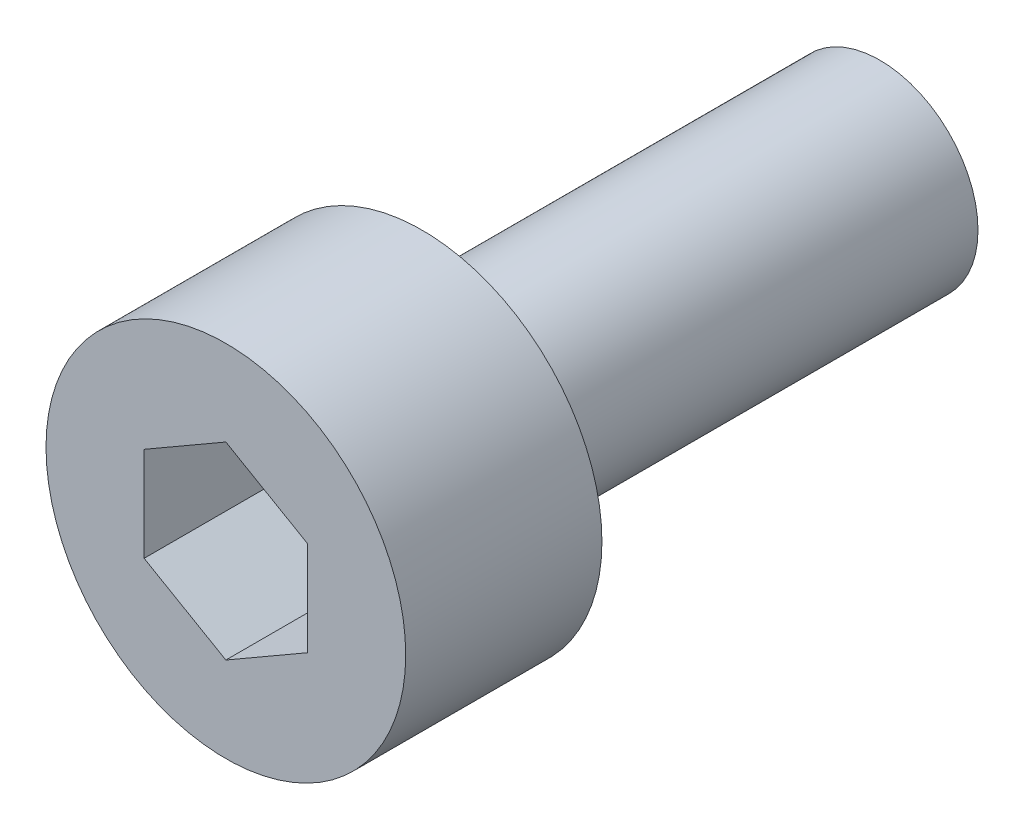
ISO-10303-21;
HEADER;
FILE_DESCRIPTION(('STEP AP214'),'2;1');
FILE_NAME('part.step','',(''),(''),'','','');
FILE_SCHEMA(('AUTOMOTIVE_DESIGN { 1 0 10303 214 1 1 1 1 }'));
ENDSEC;
DATA;
#1=APPLICATION_CONTEXT('core data for automotive mechanical design processes');
#2=APPLICATION_PROTOCOL_DEFINITION('international standard','automotive_design',2000,#1);
#3=PRODUCT_CONTEXT('',#1,'mechanical');
#4=PRODUCT('Part','Part','',(#3));
#5=PRODUCT_RELATED_PRODUCT_CATEGORY('part','',(#4));
#6=PRODUCT_DEFINITION_FORMATION('','',#4);
#7=PRODUCT_DEFINITION_CONTEXT('part definition',#1,'design');
#8=PRODUCT_DEFINITION('design','',#6,#7);
#9=PRODUCT_DEFINITION_SHAPE('','',#8);
#10=(LENGTH_UNIT() NAMED_UNIT(*) SI_UNIT(.MILLI.,.METRE.));
#11=(NAMED_UNIT(*) PLANE_ANGLE_UNIT() SI_UNIT($,.RADIAN.));
#12=(NAMED_UNIT(*) SI_UNIT($,.STERADIAN.) SOLID_ANGLE_UNIT());
#13=UNCERTAINTY_MEASURE_WITH_UNIT(LENGTH_MEASURE(1.E-05),#10,'distance_accuracy_value','');
#14=(GEOMETRIC_REPRESENTATION_CONTEXT(3) GLOBAL_UNCERTAINTY_ASSIGNED_CONTEXT((#13)) GLOBAL_UNIT_ASSIGNED_CONTEXT((#10,
#11,#12)) REPRESENTATION_CONTEXT('',''));
#15=CARTESIAN_POINT('',(0.,0.,0.));
#16=DIRECTION('',(0.,0.,1.));
#17=DIRECTION('',(1.,0.,0.));
#18=AXIS2_PLACEMENT_3D('',#15,#16,#17);
#19=CARTESIAN_POINT('',(0.,0.,0.));
#20=DIRECTION('',(0.,0.,-1.));
#21=DIRECTION('',(-1.,0.,0.));
#22=AXIS2_PLACEMENT_3D('',#19,#20,#21);
#23=CYLINDRICAL_SURFACE('',#22,1.5);
#24=CARTESIAN_POINT('',(0.,0.,0.));
#25=DIRECTION('',(0.,0.,1.));
#26=DIRECTION('',(1.,0.,0.));
#27=AXIS2_PLACEMENT_3D('',#24,#25,#26);
#28=CIRCLE('',#27,1.5);
#29=CARTESIAN_POINT('',(1.5,0.,0.));
#30=VERTEX_POINT('',#29);
#31=EDGE_CURVE('E11',#30,#30,#28,.T.);
#32=ORIENTED_EDGE('',*,*,#31,.F.);
#33=EDGE_LOOP('',(#32));
#34=FACE_BOUND('',#33,.T.);
#35=CARTESIAN_POINT('',(0.,0.,-7.));
#36=DIRECTION('',(0.,0.,1.));
#37=DIRECTION('',(1.,0.,0.));
#38=AXIS2_PLACEMENT_3D('',#35,#36,#37);
#39=CIRCLE('',#38,1.5);
#40=CARTESIAN_POINT('',(1.5,0.,-7.));
#41=VERTEX_POINT('',#40);
#42=EDGE_CURVE('E46',#41,#41,#39,.T.);
#43=ORIENTED_EDGE('',*,*,#42,.T.);
#44=EDGE_LOOP('',(#43));
#45=FACE_BOUND('',#44,.T.);
#46=ADVANCED_FACE('F43',(#34,#45),#23,.T.);
#47=CARTESIAN_POINT('',(0.,0.,-7.));
#48=DIRECTION('',(0.,0.,1.));
#49=DIRECTION('',(1.,0.,0.));
#50=AXIS2_PLACEMENT_3D('',#47,#48,#49);
#51=PLANE('',#50);
#52=ORIENTED_EDGE('',*,*,#42,.F.);
#53=EDGE_LOOP('',(#52));
#54=FACE_BOUND('',#53,.T.);
#55=ADVANCED_FACE('F164',(#54),#51,.F.);
#56=CARTESIAN_POINT('',(0.,0.,3.));
#57=DIRECTION('',(0.,0.,1.));
#58=DIRECTION('',(1.,0.,0.));
#59=AXIS2_PLACEMENT_3D('',#56,#57,#58);
#60=PLANE('',#59);
#61=CARTESIAN_POINT('',(0.,0.,3.));
#62=DIRECTION('',(0.,0.,1.));
#63=DIRECTION('',(1.,0.,0.));
#64=AXIS2_PLACEMENT_3D('',#61,#62,#63);
#65=CIRCLE('',#64,2.75);
#66=CARTESIAN_POINT('',(2.75,0.,3.));
#67=VERTEX_POINT('',#66);
#68=EDGE_CURVE('E146',#67,#67,#65,.T.);
#69=ORIENTED_EDGE('',*,*,#68,.T.);
#70=EDGE_LOOP('',(#69));
#71=FACE_BOUND('',#70,.T.);
#72=DIRECTION('',(-0.866025403784439,0.5,0.));
#73=VECTOR('',#72,1.);
#74=CARTESIAN_POINT('',(1.25,0.721687836487032,3.));
#75=LINE('',#74,#73);
#76=CARTESIAN_POINT('',(1.25,0.721687836487032,3.));
#77=VERTEX_POINT('',#76);
#78=CARTESIAN_POINT('',(0.,1.44337567297406,3.));
#79=VERTEX_POINT('',#78);
#80=EDGE_CURVE('E103',#77,#79,#75,.T.);
#81=ORIENTED_EDGE('',*,*,#80,.F.);
#82=DIRECTION('',(0.,1.,0.));
#83=VECTOR('',#82,1.);
#84=CARTESIAN_POINT('',(1.25,-0.721687836487033,3.));
#85=LINE('',#84,#83);
#86=CARTESIAN_POINT('',(1.25,-0.721687836487033,3.));
#87=VERTEX_POINT('',#86);
#88=EDGE_CURVE('E94',#87,#77,#85,.T.);
#89=ORIENTED_EDGE('',*,*,#88,.F.);
#90=DIRECTION('',(0.866025403784439,0.5,0.));
#91=VECTOR('',#90,1.);
#92=CARTESIAN_POINT('',(0.,-1.44337567297406,3.));
#93=LINE('',#92,#91);
#94=CARTESIAN_POINT('',(0.,-1.44337567297406,3.));
#95=VERTEX_POINT('',#94);
#96=EDGE_CURVE('E124',#95,#87,#93,.T.);
#97=ORIENTED_EDGE('',*,*,#96,.F.);
#98=DIRECTION('',(0.866025403784439,-0.5,0.));
#99=VECTOR('',#98,1.);
#100=CARTESIAN_POINT('',(-1.25,-0.721687836487032,3.));
#101=LINE('',#100,#99);
#102=CARTESIAN_POINT('',(-1.25,-0.721687836487032,3.));
#103=VERTEX_POINT('',#102);
#104=EDGE_CURVE('E121',#103,#95,#101,.T.);
#105=ORIENTED_EDGE('',*,*,#104,.F.);
#106=DIRECTION('',(0.,-1.,0.));
#107=VECTOR('',#106,1.);
#108=CARTESIAN_POINT('',(-1.25,0.721687836487032,3.));
#109=LINE('',#108,#107);
#110=CARTESIAN_POINT('',(-1.25,0.721687836487032,3.));
#111=VERTEX_POINT('',#110);
#112=EDGE_CURVE('E117',#111,#103,#109,.T.);
#113=ORIENTED_EDGE('',*,*,#112,.F.);
#114=DIRECTION('',(-0.866025403784439,-0.5,0.));
#115=VECTOR('',#114,1.);
#116=CARTESIAN_POINT('',(0.,1.44337567297406,3.));
#117=LINE('',#116,#115);
#118=EDGE_CURVE('E115',#79,#111,#117,.T.);
#119=ORIENTED_EDGE('',*,*,#118,.F.);
#120=EDGE_LOOP('',(#81,#89,#97,#105,#113,#119));
#121=FACE_BOUND('',#120,.T.);
#122=ADVANCED_FACE('F113',(#71,#121),#60,.T.);
#123=CARTESIAN_POINT('',(0.,0.,0.));
#124=DIRECTION('',(0.,0.,1.));
#125=DIRECTION('',(1.,0.,0.));
#126=AXIS2_PLACEMENT_3D('',#123,#124,#125);
#127=PLANE('',#126);
#128=ORIENTED_EDGE('',*,*,#31,.T.);
#129=EDGE_LOOP('',(#128));
#130=FACE_BOUND('',#129,.T.);
#131=CARTESIAN_POINT('',(0.,0.,0.));
#132=DIRECTION('',(0.,0.,1.));
#133=DIRECTION('',(1.,0.,0.));
#134=AXIS2_PLACEMENT_3D('',#131,#132,#133);
#135=CIRCLE('',#134,2.75);
#136=CARTESIAN_POINT('',(2.75,0.,0.));
#137=VERTEX_POINT('',#136);
#138=EDGE_CURVE('E109',#137,#137,#135,.T.);
#139=ORIENTED_EDGE('',*,*,#138,.F.);
#140=EDGE_LOOP('',(#139));
#141=FACE_BOUND('',#140,.T.);
#142=ADVANCED_FACE('F154',(#130,#141),#127,.F.);
#143=CARTESIAN_POINT('',(0.,0.,3.));
#144=DIRECTION('',(0.,0.,-1.));
#145=DIRECTION('',(-1.,0.,0.));
#146=AXIS2_PLACEMENT_3D('',#143,#144,#145);
#147=CYLINDRICAL_SURFACE('',#146,2.75);
#148=ORIENTED_EDGE('',*,*,#68,.F.);
#149=EDGE_LOOP('',(#148));
#150=FACE_BOUND('',#149,.T.);
#151=ORIENTED_EDGE('',*,*,#138,.T.);
#152=EDGE_LOOP('',(#151));
#153=FACE_BOUND('',#152,.T.);
#154=ADVANCED_FACE('F152',(#150,#153),#147,.T.);
#155=CARTESIAN_POINT('',(1.25,-0.721687836487033,3.));
#156=DIRECTION('',(-1.,0.,0.));
#157=DIRECTION('',(0.,-1.,0.));
#158=AXIS2_PLACEMENT_3D('',#155,#156,#157);
#159=PLANE('',#158);
#160=DIRECTION('',(0.,1.,0.));
#161=VECTOR('',#160,1.);
#162=CARTESIAN_POINT('',(1.25,-0.721687836487033,0.));
#163=LINE('',#162,#161);
#164=CARTESIAN_POINT('',(1.25,-0.721687836487033,0.));
#165=VERTEX_POINT('',#164);
#166=CARTESIAN_POINT('',(1.25,0.721687836487032,0.));
#167=VERTEX_POINT('',#166);
#168=EDGE_CURVE('E57',#165,#167,#163,.T.);
#169=ORIENTED_EDGE('',*,*,#168,.F.);
#170=DIRECTION('',(0.,0.,-1.));
#171=VECTOR('',#170,1.);
#172=CARTESIAN_POINT('',(1.25,-0.721687836487033,3.));
#173=LINE('',#172,#171);
#174=EDGE_CURVE('E99',#87,#165,#173,.T.);
#175=ORIENTED_EDGE('',*,*,#174,.F.);
#176=ORIENTED_EDGE('',*,*,#88,.T.);
#177=DIRECTION('',(0.,0.,-1.));
#178=VECTOR('',#177,1.);
#179=CARTESIAN_POINT('',(1.25,0.721687836487032,3.));
#180=LINE('',#179,#178);
#181=EDGE_CURVE('E97',#77,#167,#180,.T.);
#182=ORIENTED_EDGE('',*,*,#181,.T.);
#183=EDGE_LOOP('',(#169,#175,#176,#182));
#184=FACE_BOUND('',#183,.T.);
#185=ADVANCED_FACE('F96',(#184),#159,.T.);
#186=CARTESIAN_POINT('',(1.25,0.721687836487032,3.));
#187=DIRECTION('',(-0.5,-0.866025403784439,0.));
#188=DIRECTION('',(0.866025403784439,-0.5,0.));
#189=AXIS2_PLACEMENT_3D('',#186,#187,#188);
#190=PLANE('',#189);
#191=DIRECTION('',(-0.866025403784439,0.5,0.));
#192=VECTOR('',#191,1.);
#193=CARTESIAN_POINT('',(1.25,0.721687836487032,0.));
#194=LINE('',#193,#192);
#195=CARTESIAN_POINT('',(0.,1.44337567297406,0.));
#196=VERTEX_POINT('',#195);
#197=EDGE_CURVE('E61',#167,#196,#194,.T.);
#198=ORIENTED_EDGE('',*,*,#197,.F.);
#199=ORIENTED_EDGE('',*,*,#181,.F.);
#200=ORIENTED_EDGE('',*,*,#80,.T.);
#201=DIRECTION('',(0.,0.,-1.));
#202=VECTOR('',#201,1.);
#203=CARTESIAN_POINT('',(0.,1.44337567297406,3.));
#204=LINE('',#203,#202);
#205=EDGE_CURVE('E110',#79,#196,#204,.T.);
#206=ORIENTED_EDGE('',*,*,#205,.T.);
#207=EDGE_LOOP('',(#198,#199,#200,#206));
#208=FACE_BOUND('',#207,.T.);
#209=ADVANCED_FACE('F107',(#208),#190,.T.);
#210=CARTESIAN_POINT('',(0.,1.44337567297406,3.));
#211=DIRECTION('',(0.5,-0.866025403784439,0.));
#212=DIRECTION('',(0.866025403784439,0.5,0.));
#213=AXIS2_PLACEMENT_3D('',#210,#211,#212);
#214=PLANE('',#213);
#215=DIRECTION('',(-0.866025403784439,-0.5,0.));
#216=VECTOR('',#215,1.);
#217=CARTESIAN_POINT('',(0.,1.44337567297406,0.));
#218=LINE('',#217,#216);
#219=CARTESIAN_POINT('',(-1.25,0.721687836487032,0.));
#220=VERTEX_POINT('',#219);
#221=EDGE_CURVE('E128',#196,#220,#218,.T.);
#222=ORIENTED_EDGE('',*,*,#221,.F.);
#223=ORIENTED_EDGE('',*,*,#205,.F.);
#224=ORIENTED_EDGE('',*,*,#118,.T.);
#225=DIRECTION('',(0.,0.,-1.));
#226=VECTOR('',#225,1.);
#227=CARTESIAN_POINT('',(-1.25,0.721687836487032,3.));
#228=LINE('',#227,#226);
#229=EDGE_CURVE('E142',#111,#220,#228,.T.);
#230=ORIENTED_EDGE('',*,*,#229,.T.);
#231=EDGE_LOOP('',(#222,#223,#224,#230));
#232=FACE_BOUND('',#231,.T.);
#233=ADVANCED_FACE('F199',(#232),#214,.T.);
#234=CARTESIAN_POINT('',(-1.25,0.721687836487032,3.));
#235=DIRECTION('',(1.,0.,0.));
#236=DIRECTION('',(0.,1.,0.));
#237=AXIS2_PLACEMENT_3D('',#234,#235,#236);
#238=PLANE('',#237);
#239=DIRECTION('',(0.,-1.,0.));
#240=VECTOR('',#239,1.);
#241=CARTESIAN_POINT('',(-1.25,0.721687836487032,0.));
#242=LINE('',#241,#240);
#243=CARTESIAN_POINT('',(-1.25,-0.721687836487033,0.));
#244=VERTEX_POINT('',#243);
#245=EDGE_CURVE('E130',#220,#244,#242,.T.);
#246=ORIENTED_EDGE('',*,*,#245,.F.);
#247=ORIENTED_EDGE('',*,*,#229,.F.);
#248=ORIENTED_EDGE('',*,*,#112,.T.);
#249=DIRECTION('',(0.,0.,-1.));
#250=VECTOR('',#249,1.);
#251=CARTESIAN_POINT('',(-1.25,-0.721687836487032,3.));
#252=LINE('',#251,#250);
#253=EDGE_CURVE('E139',#103,#244,#252,.T.);
#254=ORIENTED_EDGE('',*,*,#253,.T.);
#255=EDGE_LOOP('',(#246,#247,#248,#254));
#256=FACE_BOUND('',#255,.T.);
#257=ADVANCED_FACE('F192',(#256),#238,.T.);
#258=CARTESIAN_POINT('',(-1.25,-0.721687836487032,3.));
#259=DIRECTION('',(0.5,0.866025403784439,0.));
#260=DIRECTION('',(-0.866025403784439,0.5,0.));
#261=AXIS2_PLACEMENT_3D('',#258,#259,#260);
#262=PLANE('',#261);
#263=DIRECTION('',(0.866025403784439,-0.5,0.));
#264=VECTOR('',#263,1.);
#265=CARTESIAN_POINT('',(-1.25,-0.721687836487032,0.));
#266=LINE('',#265,#264);
#267=CARTESIAN_POINT('',(0.,-1.44337567297406,0.));
#268=VERTEX_POINT('',#267);
#269=EDGE_CURVE('E132',#244,#268,#266,.T.);
#270=ORIENTED_EDGE('',*,*,#269,.F.);
#271=ORIENTED_EDGE('',*,*,#253,.F.);
#272=ORIENTED_EDGE('',*,*,#104,.T.);
#273=DIRECTION('',(0.,0.,-1.));
#274=VECTOR('',#273,1.);
#275=CARTESIAN_POINT('',(0.,-1.44337567297406,3.));
#276=LINE('',#275,#274);
#277=EDGE_CURVE('E136',#95,#268,#276,.T.);
#278=ORIENTED_EDGE('',*,*,#277,.T.);
#279=EDGE_LOOP('',(#270,#271,#272,#278));
#280=FACE_BOUND('',#279,.T.);
#281=ADVANCED_FACE('F186',(#280),#262,.T.);
#282=CARTESIAN_POINT('',(0.,-1.44337567297406,3.));
#283=DIRECTION('',(-0.5,0.866025403784439,0.));
#284=DIRECTION('',(-0.866025403784439,-0.5,0.));
#285=AXIS2_PLACEMENT_3D('',#282,#283,#284);
#286=PLANE('',#285);
#287=DIRECTION('',(0.866025403784439,0.5,0.));
#288=VECTOR('',#287,1.);
#289=CARTESIAN_POINT('',(0.,-1.44337567297406,0.));
#290=LINE('',#289,#288);
#291=EDGE_CURVE('E104',#268,#165,#290,.T.);
#292=ORIENTED_EDGE('',*,*,#291,.F.);
#293=ORIENTED_EDGE('',*,*,#277,.F.);
#294=ORIENTED_EDGE('',*,*,#96,.T.);
#295=ORIENTED_EDGE('',*,*,#174,.T.);
#296=EDGE_LOOP('',(#292,#293,#294,#295));
#297=FACE_BOUND('',#296,.T.);
#298=ADVANCED_FACE('F182',(#297),#286,.T.);
#299=CARTESIAN_POINT('',(0.,0.,0.));
#300=DIRECTION('',(0.,0.,1.));
#301=DIRECTION('',(1.,0.,0.));
#302=AXIS2_PLACEMENT_3D('',#299,#300,#301);
#303=PLANE('',#302);
#304=ORIENTED_EDGE('',*,*,#168,.T.);
#305=ORIENTED_EDGE('',*,*,#197,.T.);
#306=ORIENTED_EDGE('',*,*,#221,.T.);
#307=ORIENTED_EDGE('',*,*,#245,.T.);
#308=ORIENTED_EDGE('',*,*,#269,.T.);
#309=ORIENTED_EDGE('',*,*,#291,.T.);
#310=EDGE_LOOP('',(#304,#305,#306,#307,#308,#309));
#311=FACE_BOUND('',#310,.T.);
#312=ADVANCED_FACE('F180',(#311),#303,.T.);
#313=CLOSED_SHELL('',(#46,#55,#122,#142,#154,#185,#209,#233,#257,#281,#298,#312));
#314=MANIFOLD_SOLID_BREP('B2',#313);
#315=ADVANCED_BREP_SHAPE_REPRESENTATION('',(#18,#314),#14);
#316=SHAPE_DEFINITION_REPRESENTATION(#9,#315);
ENDSEC;
END-ISO-10303-21;
